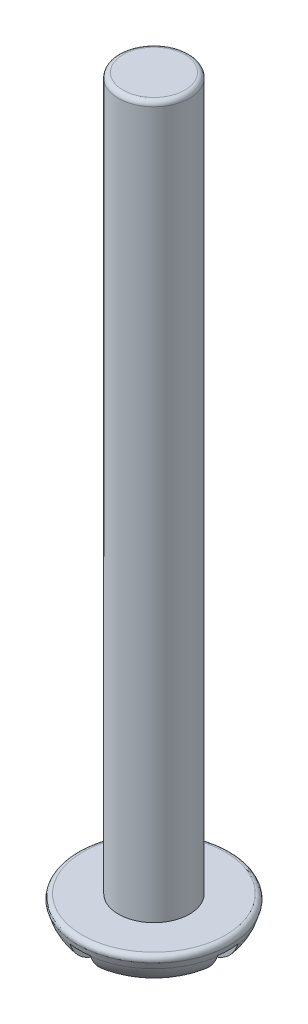
ISO-10303-21;
HEADER;
FILE_DESCRIPTION(('STEP AP214'),'2;1');
FILE_NAME('part.step','',(''),(''),'','','');
FILE_SCHEMA(('AUTOMOTIVE_DESIGN { 1 0 10303 214 1 1 1 1 }'));
ENDSEC;
DATA;
#1=APPLICATION_CONTEXT('core data for automotive mechanical design processes');
#2=APPLICATION_PROTOCOL_DEFINITION('international standard','automotive_design',2000,#1);
#3=PRODUCT_CONTEXT('',#1,'mechanical');
#4=PRODUCT('Part','Part','',(#3));
#5=PRODUCT_RELATED_PRODUCT_CATEGORY('part','',(#4));
#6=PRODUCT_DEFINITION_FORMATION('','',#4);
#7=PRODUCT_DEFINITION_CONTEXT('part definition',#1,'design');
#8=PRODUCT_DEFINITION('design','',#6,#7);
#9=PRODUCT_DEFINITION_SHAPE('','',#8);
#10=(LENGTH_UNIT() NAMED_UNIT(*) SI_UNIT(.MILLI.,.METRE.));
#11=(NAMED_UNIT(*) PLANE_ANGLE_UNIT() SI_UNIT($,.RADIAN.));
#12=(NAMED_UNIT(*) SI_UNIT($,.STERADIAN.) SOLID_ANGLE_UNIT());
#13=UNCERTAINTY_MEASURE_WITH_UNIT(LENGTH_MEASURE(1.E-05),#10,'distance_accuracy_value','');
#14=(GEOMETRIC_REPRESENTATION_CONTEXT(3) GLOBAL_UNCERTAINTY_ASSIGNED_CONTEXT((#13)) GLOBAL_UNIT_ASSIGNED_CONTEXT((#10,
#11,#12)) REPRESENTATION_CONTEXT('',''));
#15=CARTESIAN_POINT('',(0.,0.,0.));
#16=DIRECTION('',(0.,0.,1.));
#17=DIRECTION('',(1.,0.,0.));
#18=AXIS2_PLACEMENT_3D('',#15,#16,#17);
#19=CARTESIAN_POINT('',(0.,-51.2440445445355,0.));
#20=DIRECTION('',(0.,1.,0.));
#21=DIRECTION('',(0.,0.,1.));
#22=AXIS2_PLACEMENT_3D('',#19,#20,#21);
#23=PLANE('',#22);
#24=DIRECTION('',(0.,0.,1.));
#25=VECTOR('',#24,1.);
#26=CARTESIAN_POINT('',(10.4297382638731,-51.2440445445355,50.0394058023663));
#27=LINE('',#26,#25);
#28=CARTESIAN_POINT('',(10.4297382638731,-51.2440445445125,48.0079709183444));
#29=VERTEX_POINT('',#28);
#30=CARTESIAN_POINT('',(10.4297382638731,-51.2440445445355,45.3297382638731));
#31=VERTEX_POINT('',#30);
#32=EDGE_CURVE('E534',#29,#31,#27,.F.);
#33=ORIENTED_EDGE('',*,*,#32,.F.);
#34=CARTESIAN_POINT('',(10.,-51.2440445444895,44.9));
#35=DIRECTION('',(0.,1.,0.));
#36=DIRECTION('',(0.,0.,1.));
#37=AXIS2_PLACEMENT_3D('',#34,#35,#36);
#38=CIRCLE('',#37,3.13754015189303);
#39=CARTESIAN_POINT('',(9.57026173612696,-51.2440445445125,48.0079709183472));
#40=VERTEX_POINT('',#39);
#41=EDGE_CURVE('E388',#40,#29,#38,.T.);
#42=ORIENTED_EDGE('',*,*,#41,.F.);
#43=DIRECTION('',(0.,0.,1.));
#44=VECTOR('',#43,1.);
#45=CARTESIAN_POINT('',(9.57026173612696,-51.2440445445355,50.0394058023663));
#46=LINE('',#45,#44);
#47=CARTESIAN_POINT('',(9.57026173612696,-51.2440445445355,45.3297382638731));
#48=VERTEX_POINT('',#47);
#49=EDGE_CURVE('E547',#40,#48,#46,.F.);
#50=ORIENTED_EDGE('',*,*,#49,.T.);
#51=DIRECTION('',(1.,0.,0.));
#52=VECTOR('',#51,1.);
#53=CARTESIAN_POINT('',(4.46020889716683,-51.2440445445355,45.3297382638731));
#54=LINE('',#53,#52);
#55=CARTESIAN_POINT('',(6.89202908165562,-51.2440445445125,45.3297382638731));
#56=VERTEX_POINT('',#55);
#57=EDGE_CURVE('E544',#56,#48,#54,.T.);
#58=ORIENTED_EDGE('',*,*,#57,.F.);
#59=CARTESIAN_POINT('',(10.,-51.2440445444895,44.9));
#60=DIRECTION('',(0.,1.,0.));
#61=DIRECTION('',(0.,0.,1.));
#62=AXIS2_PLACEMENT_3D('',#59,#60,#61);
#63=CIRCLE('',#62,3.13754015189303);
#64=CARTESIAN_POINT('',(6.89202908165286,-51.2440445445125,44.4702617361269));
#65=VERTEX_POINT('',#64);
#66=EDGE_CURVE('E391',#65,#56,#63,.T.);
#67=ORIENTED_EDGE('',*,*,#66,.F.);
#68=DIRECTION('',(1.,0.,0.));
#69=VECTOR('',#68,1.);
#70=CARTESIAN_POINT('',(4.46020889716683,-51.2440445445355,44.4702617361269));
#71=LINE('',#70,#69);
#72=CARTESIAN_POINT('',(9.57026173612696,-51.2440445445355,44.4702617361269));
#73=VERTEX_POINT('',#72);
#74=EDGE_CURVE('E269',#65,#73,#71,.T.);
#75=ORIENTED_EDGE('',*,*,#74,.T.);
#76=DIRECTION('',(0.,0.,1.));
#77=VECTOR('',#76,1.);
#78=CARTESIAN_POINT('',(9.57026173612696,-51.2440445445355,50.0394058023663));
#79=LINE('',#78,#77);
#80=CARTESIAN_POINT('',(9.57026173612696,-51.2440445445125,41.7920290816556));
#81=VERTEX_POINT('',#80);
#82=EDGE_CURVE('E505',#73,#81,#79,.F.);
#83=ORIENTED_EDGE('',*,*,#82,.T.);
#84=CARTESIAN_POINT('',(10.,-51.2440445444895,44.9));
#85=DIRECTION('',(0.,1.,0.));
#86=DIRECTION('',(0.,0.,1.));
#87=AXIS2_PLACEMENT_3D('',#84,#85,#86);
#88=CIRCLE('',#87,3.13754015189303);
#89=CARTESIAN_POINT('',(10.4297382638731,-51.2440445445125,41.7920290816528));
#90=VERTEX_POINT('',#89);
#91=EDGE_CURVE('E155',#90,#81,#88,.T.);
#92=ORIENTED_EDGE('',*,*,#91,.F.);
#93=DIRECTION('',(0.,0.,1.));
#94=VECTOR('',#93,1.);
#95=CARTESIAN_POINT('',(10.4297382638731,-51.2440445445355,50.0394058023663));
#96=LINE('',#95,#94);
#97=CARTESIAN_POINT('',(10.4297382638731,-51.2440445445355,44.4702617361269));
#98=VERTEX_POINT('',#97);
#99=EDGE_CURVE('E162',#98,#90,#96,.F.);
#100=ORIENTED_EDGE('',*,*,#99,.F.);
#101=DIRECTION('',(1.,0.,0.));
#102=VECTOR('',#101,1.);
#103=CARTESIAN_POINT('',(4.46020889716683,-51.2440445445355,44.4702617361269));
#104=LINE('',#103,#102);
#105=CARTESIAN_POINT('',(13.1079709183444,-51.2440445445125,44.4702617361269));
#106=VERTEX_POINT('',#105);
#107=EDGE_CURVE('E158',#98,#106,#104,.T.);
#108=ORIENTED_EDGE('',*,*,#107,.T.);
#109=CARTESIAN_POINT('',(10.,-51.2440445444895,44.9));
#110=DIRECTION('',(0.,1.,0.));
#111=DIRECTION('',(0.,0.,1.));
#112=AXIS2_PLACEMENT_3D('',#109,#110,#111);
#113=CIRCLE('',#112,3.13754015189303);
#114=CARTESIAN_POINT('',(13.1079709183472,-51.2440445445125,45.3297382638731));
#115=VERTEX_POINT('',#114);
#116=EDGE_CURVE('E142',#115,#106,#113,.T.);
#117=ORIENTED_EDGE('',*,*,#116,.F.);
#118=DIRECTION('',(1.,0.,0.));
#119=VECTOR('',#118,1.);
#120=CARTESIAN_POINT('',(4.46020889716683,-51.2440445445355,45.3297382638731));
#121=LINE('',#120,#119);
#122=EDGE_CURVE('E188',#31,#115,#121,.T.);
#123=ORIENTED_EDGE('',*,*,#122,.F.);
#124=EDGE_LOOP('',(#33,#42,#50,#58,#67,#75,#83,#92,#100,#108,#117,#123));
#125=FACE_BOUND('',#124,.T.);
#126=ADVANCED_FACE('F18',(#125),#23,.F.);
#127=CARTESIAN_POINT('',(9.57026173612696,-51.2440445445355,50.0394058023663));
#128=DIRECTION('',(-1.,0.,0.));
#129=DIRECTION('',(0.,-1.,0.));
#130=AXIS2_PLACEMENT_3D('',#127,#128,#129);
#131=PLANE('',#130);
#132=DIRECTION('',(0.,0.,1.));
#133=VECTOR('',#132,1.);
#134=CARTESIAN_POINT('',(9.57026173612696,-52.2440445445355,44.9));
#135=LINE('',#134,#133);
#136=CARTESIAN_POINT('',(9.57026173612696,-52.2440445445355,45.3297382638731));
#137=VERTEX_POINT('',#136);
#138=CARTESIAN_POINT('',(9.57026173612696,-52.2440445445355,46.6432741973379));
#139=VERTEX_POINT('',#138);
#140=EDGE_CURVE('E543',#137,#139,#135,.T.);
#141=ORIENTED_EDGE('',*,*,#140,.F.);
#142=DIRECTION('',(0.,1.,0.));
#143=VECTOR('',#142,1.);
#144=CARTESIAN_POINT('',(9.57026173612696,-51.2440445445355,45.3297382638731));
#145=LINE('',#144,#143);
#146=EDGE_CURVE('E540',#48,#137,#145,.F.);
#147=ORIENTED_EDGE('',*,*,#146,.F.);
#148=ORIENTED_EDGE('',*,*,#49,.F.);
#149=DIRECTION('',(0.,0.950186561036227,0.311681727449893));
#150=VECTOR('',#149,1.);
#151=CARTESIAN_POINT('',(9.57026173612696,-51.2766683366604,47.9972696094573));
#152=LINE('',#151,#150);
#153=CARTESIAN_POINT('',(9.57026173612696,-51.2766683366506,47.9972696094605));
#154=VERTEX_POINT('',#153);
#155=EDGE_CURVE('E390',#154,#40,#152,.T.);
#156=ORIENTED_EDGE('',*,*,#155,.F.);
#157=CARTESIAN_POINT('',(9.57026173612696,-52.2440445445355,46.6432741973379));
#158=CARTESIAN_POINT('',(9.57026173612696,-52.2440517508388,46.6881301465086));
#159=CARTESIAN_POINT('',(9.57026173612696,-52.242012211474,46.7329882302311));
#160=CARTESIAN_POINT('',(9.57026173612696,-52.2338386033224,46.8223397292442));
#161=CARTESIAN_POINT('',(9.57026173612696,-52.2277035882181,46.8668330578472));
#162=CARTESIAN_POINT('',(9.57026173612696,-52.2113435508746,46.9550350246917));
#163=CARTESIAN_POINT('',(9.57026173612696,-52.2011213125293,46.9987441759228));
#164=CARTESIAN_POINT('',(9.57026173612696,-52.1766544744115,47.0850007763118));
#165=CARTESIAN_POINT('',(9.57026173612696,-52.1624106079993,47.1275484357224));
#166=CARTESIAN_POINT('',(9.57026173612696,-52.116579759776,47.2456445128962));
#167=CARTESIAN_POINT('',(9.57026173612696,-52.080378767751,47.3194636126151));
#168=CARTESIAN_POINT('',(9.57026173612696,-51.9958084458344,47.459666913603));
#169=CARTESIAN_POINT('',(9.57026173612696,-51.9474469285752,47.5260558490211));
#170=CARTESIAN_POINT('',(9.57026173612696,-51.8413198326966,47.6478278381575));
#171=CARTESIAN_POINT('',(9.57026173612696,-51.783829643513,47.7034510174651));
#172=CARTESIAN_POINT('',(9.57026173612696,-51.660217490618,47.8040866049667));
#173=CARTESIAN_POINT('',(9.57026173612698,-51.5941003742937,47.8491049323687));
#174=CARTESIAN_POINT('',(9.57026173612695,-51.4852083664642,47.9103176350552));
#175=CARTESIAN_POINT('',(9.57026173612693,-51.4446618838942,47.9305704285893));
#176=CARTESIAN_POINT('',(9.57026173612699,-51.3618677526718,47.9669984341043));
#177=CARTESIAN_POINT('',(9.57026173612707,-51.3196234370506,47.9831812220735));
#178=CARTESIAN_POINT('',(9.57026173612727,-51.2766683366561,47.9972696094587));
#179=B_SPLINE_CURVE_WITH_KNOTS('',3,(#157,#158,#159,#160,#161,#162,#163,#164,#165,#166,#167,
#168,#169,#170,#171,#172,#173,#174,#175,#176,#177,#178),.UNSPECIFIED.,.F.,.F.,(4,2,2,2,2,2,2,2,
2,2,4),(0.,0.134523842047519,0.269078778491122,0.403542222429795,0.537981162231517,
0.783317564876037,1.02849674999737,1.26733850226078,1.5060466249651,1.64182243435796,
1.77734360560221),.UNSPECIFIED.);
#180=EDGE_CURVE('E262',#139,#154,#179,.T.);
#181=ORIENTED_EDGE('',*,*,#180,.F.);
#182=EDGE_LOOP('',(#141,#147,#148,#156,#181));
#183=FACE_BOUND('',#182,.T.);
#184=ADVANCED_FACE('F377',(#183),#131,.F.);
#185=CARTESIAN_POINT('',(4.46020889716683,-51.2440445445355,45.3297382638731));
#186=DIRECTION('',(0.,0.,-1.));
#187=DIRECTION('',(0.,1.,0.));
#188=AXIS2_PLACEMENT_3D('',#185,#186,#187);
#189=PLANE('',#188);
#190=DIRECTION('',(1.,0.,0.));
#191=VECTOR('',#190,1.);
#192=CARTESIAN_POINT('',(10.,-52.2440445445355,45.3297382638731));
#193=LINE('',#192,#191);
#194=CARTESIAN_POINT('',(8.25672580266215,-52.2440445445355,45.3297382638731));
#195=VERTEX_POINT('',#194);
#196=EDGE_CURVE('E565',#195,#137,#193,.T.);
#197=ORIENTED_EDGE('',*,*,#196,.F.);
#198=CARTESIAN_POINT('',(6.90273039054124,-51.276668336656,45.3297382638731));
#199=CARTESIAN_POINT('',(6.91497019050474,-51.3139806844597,45.3297382638731));
#200=CARTESIAN_POINT('',(6.92878654769642,-51.3507557521779,45.3297382638731));
#201=CARTESIAN_POINT('',(6.95947563099631,-51.4230043509714,45.3297382638731));
#202=CARTESIAN_POINT('',(6.97634812160456,-51.4584779820798,45.3297382638731));
#203=CARTESIAN_POINT('',(7.03134429321369,-51.5624945272515,45.3297382638731));
#204=CARTESIAN_POINT('',(7.07388977168227,-51.6287639426499,45.3297382638731));
#205=CARTESIAN_POINT('',(7.16947807480539,-51.7532117619153,45.3297382638731));
#206=CARTESIAN_POINT('',(7.22252373513465,-51.8113879728923,45.3297382638731));
#207=CARTESIAN_POINT('',(7.33757042584209,-51.9180667957562,45.3297382638731));
#208=CARTESIAN_POINT('',(7.3995694651401,-51.9665715527166,45.3297382638731));
#209=CARTESIAN_POINT('',(7.53113763895904,-52.0528868607374,45.3297382638731));
#210=CARTESIAN_POINT('',(7.60075026441981,-52.0906310006598,45.3297382638731));
#211=CARTESIAN_POINT('',(7.74527984697558,-52.1541000828859,45.3297382638731));
#212=CARTESIAN_POINT('',(7.8201977126339,-52.1798229606953,45.3297382638731));
#213=CARTESIAN_POINT('',(7.95550179678722,-52.2141903018016,45.3297382638731));
#214=CARTESIAN_POINT('',(8.01525126070812,-52.2254062108367,45.3297382638731));
#215=CARTESIAN_POINT('',(8.13557393478325,-52.2403368668091,45.3297382638731));
#216=CARTESIAN_POINT('',(8.19614549408786,-52.2440648962271,45.3297382638731));
#217=CARTESIAN_POINT('',(8.25672580266215,-52.2440445445355,45.3297382638731));
#218=B_SPLINE_CURVE_WITH_KNOTS('',3,(#198,#199,#200,#201,#202,#203,#204,#205,#206,#207,#208,
#209,#210,#211,#212,#213,#214,#215,#216,#217),.UNSPECIFIED.,.F.,.F.,(4,2,2,2,2,2,2,2,2,4),(0.,
0.117732729425165,0.235456390442122,0.470495711789333,0.70559859456991,0.940649274725501,
1.17712067374326,1.41363266871307,1.59555904089511,1.77716241440037),.UNSPECIFIED.);
#219=CARTESIAN_POINT('',(6.90273039053949,-51.2766683366506,45.3297382638731));
#220=VERTEX_POINT('',#219);
#221=EDGE_CURVE('E351',#220,#195,#218,.T.);
#222=ORIENTED_EDGE('',*,*,#221,.F.);
#223=DIRECTION('',(-0.31168172744987,0.950186561036234,0.));
#224=VECTOR('',#223,1.);
#225=CARTESIAN_POINT('',(6.90273039054271,-51.2766683366604,45.3297382638731));
#226=LINE('',#225,#224);
#227=EDGE_CURVE('E549',#220,#56,#226,.T.);
#228=ORIENTED_EDGE('',*,*,#227,.T.);
#229=ORIENTED_EDGE('',*,*,#57,.T.);
#230=ORIENTED_EDGE('',*,*,#146,.T.);
#231=EDGE_LOOP('',(#197,#222,#228,#229,#230));
#232=FACE_BOUND('',#231,.T.);
#233=ADVANCED_FACE('F372',(#232),#189,.T.);
#234=CARTESIAN_POINT('',(10.,-52.2440445445355,44.9));
#235=DIRECTION('',(0.,-1.,0.));
#236=DIRECTION('',(1.,0.,0.));
#237=AXIS2_PLACEMENT_3D('',#234,#235,#236);
#238=PLANE('',#237);
#239=CARTESIAN_POINT('',(10.,-52.2440445445355,44.9));
#240=DIRECTION('',(0.,1.,0.));
#241=DIRECTION('',(-0.970934082360066,0.,0.239347044501527));
#242=AXIS2_PLACEMENT_3D('',#239,#240,#241);
#243=CIRCLE('',#242,1.79546091646146);
#244=EDGE_CURVE('E348',#195,#139,#243,.T.);
#245=ORIENTED_EDGE('',*,*,#244,.F.);
#246=ORIENTED_EDGE('',*,*,#196,.T.);
#247=ORIENTED_EDGE('',*,*,#140,.T.);
#248=EDGE_LOOP('',(#245,#246,#247));
#249=FACE_BOUND('',#248,.T.);
#250=ADVANCED_FACE('F376',(#249),#238,.T.);
#251=CARTESIAN_POINT('',(10.4297382638731,-51.2440445445355,50.0394058023663));
#252=DIRECTION('',(-1.,0.,0.));
#253=DIRECTION('',(0.,-1.,0.));
#254=AXIS2_PLACEMENT_3D('',#251,#252,#253);
#255=PLANE('',#254);
#256=DIRECTION('',(0.,0.,1.));
#257=VECTOR('',#256,1.);
#258=CARTESIAN_POINT('',(10.4297382638731,-52.2440445445355,44.9));
#259=LINE('',#258,#257);
#260=CARTESIAN_POINT('',(10.4297382638731,-52.2440445445355,46.6432741973379));
#261=VERTEX_POINT('',#260);
#262=CARTESIAN_POINT('',(10.4297382638731,-52.2440445445355,45.3297382638731));
#263=VERTEX_POINT('',#262);
#264=EDGE_CURVE('E536',#261,#263,#259,.F.);
#265=ORIENTED_EDGE('',*,*,#264,.F.);
#266=CARTESIAN_POINT('',(10.4297382638731,-51.276668336656,47.9972696094588));
#267=CARTESIAN_POINT('',(10.4297382638731,-51.3139806844597,47.9850298094953));
#268=CARTESIAN_POINT('',(10.4297382638731,-51.3507557521779,47.9712134523036));
#269=CARTESIAN_POINT('',(10.4297382638731,-51.4230043509714,47.9405243690037));
#270=CARTESIAN_POINT('',(10.4297382638731,-51.4584779820798,47.9236518783955));
#271=CARTESIAN_POINT('',(10.4297382638731,-51.5624945272515,47.8686557067863));
#272=CARTESIAN_POINT('',(10.4297382638731,-51.6287639426499,47.8261102283178));
#273=CARTESIAN_POINT('',(10.4297382638731,-51.7532117619153,47.7305219251946));
#274=CARTESIAN_POINT('',(10.4297382638731,-51.8113879728923,47.6774762648654));
#275=CARTESIAN_POINT('',(10.4297382638731,-51.9180667957562,47.5624295741579));
#276=CARTESIAN_POINT('',(10.4297382638731,-51.9665715527166,47.5004305348599));
#277=CARTESIAN_POINT('',(10.4297382638731,-52.0528868607374,47.368862361041));
#278=CARTESIAN_POINT('',(10.4297382638731,-52.0906310006598,47.2992497355802));
#279=CARTESIAN_POINT('',(10.4297382638731,-52.1541000828859,47.1547201530244));
#280=CARTESIAN_POINT('',(10.4297382638731,-52.1798229606953,47.0798022873661));
#281=CARTESIAN_POINT('',(10.4297382638731,-52.2141903018016,46.9444982032128));
#282=CARTESIAN_POINT('',(10.4297382638731,-52.2254062108367,46.8847487392919));
#283=CARTESIAN_POINT('',(10.4297382638731,-52.2403368668091,46.7644260652168));
#284=CARTESIAN_POINT('',(10.4297382638731,-52.2440648962271,46.7038545059122));
#285=CARTESIAN_POINT('',(10.4297382638731,-52.2440445445355,46.6432741973379));
#286=B_SPLINE_CURVE_WITH_KNOTS('',3,(#266,#267,#268,#269,#270,#271,#272,#273,#274,#275,#276,
#277,#278,#279,#280,#281,#282,#283,#284,#285),.UNSPECIFIED.,.F.,.F.,(4,2,2,2,2,2,2,2,2,4),(0.,
0.117732729425164,0.23545639044212,0.470495711789333,0.705598594569909,0.940649274725502,
1.17712067374326,1.41363266871308,1.59555904089511,1.77716241440038),.UNSPECIFIED.);
#287=CARTESIAN_POINT('',(10.4297382638731,-51.2766683366506,47.9972696094605));
#288=VERTEX_POINT('',#287);
#289=EDGE_CURVE('E229',#288,#261,#286,.T.);
#290=ORIENTED_EDGE('',*,*,#289,.F.);
#291=DIRECTION('',(0.,0.950186561036227,0.311681727449893));
#292=VECTOR('',#291,1.);
#293=CARTESIAN_POINT('',(10.4297382638731,-51.2766683366604,47.9972696094573));
#294=LINE('',#293,#292);
#295=EDGE_CURVE('E537',#288,#29,#294,.T.);
#296=ORIENTED_EDGE('',*,*,#295,.T.);
#297=ORIENTED_EDGE('',*,*,#32,.T.);
#298=DIRECTION('',(0.,1.,0.));
#299=VECTOR('',#298,1.);
#300=CARTESIAN_POINT('',(10.4297382638731,-51.2440445445355,45.3297382638731));
#301=LINE('',#300,#299);
#302=EDGE_CURVE('E526',#263,#31,#301,.T.);
#303=ORIENTED_EDGE('',*,*,#302,.F.);
#304=EDGE_LOOP('',(#265,#290,#296,#297,#303));
#305=FACE_BOUND('',#304,.T.);
#306=ADVANCED_FACE('F617',(#305),#255,.T.);
#307=CARTESIAN_POINT('',(10.,-52.2440445445355,44.9));
#308=DIRECTION('',(0.,-1.,0.));
#309=DIRECTION('',(1.,0.,0.));
#310=AXIS2_PLACEMENT_3D('',#307,#308,#309);
#311=PLANE('',#310);
#312=ORIENTED_EDGE('',*,*,#264,.T.);
#313=DIRECTION('',(1.,0.,0.));
#314=VECTOR('',#313,1.);
#315=CARTESIAN_POINT('',(4.46020889716683,-52.2440445445355,45.3297382638731));
#316=LINE('',#315,#314);
#317=CARTESIAN_POINT('',(11.7432741973325,-52.2440445445355,45.3297382638734));
#318=VERTEX_POINT('',#317);
#319=EDGE_CURVE('E531',#318,#263,#316,.F.);
#320=ORIENTED_EDGE('',*,*,#319,.F.);
#321=CARTESIAN_POINT('',(10.,-52.2440445445355,44.9));
#322=DIRECTION('',(0.,1.,0.));
#323=DIRECTION('',(0.239347044501533,0.,0.970934082360065));
#324=AXIS2_PLACEMENT_3D('',#321,#322,#323);
#325=CIRCLE('',#324,1.79546091646145);
#326=EDGE_CURVE('E341',#261,#318,#325,.T.);
#327=ORIENTED_EDGE('',*,*,#326,.F.);
#328=EDGE_LOOP('',(#312,#320,#327));
#329=FACE_BOUND('',#328,.T.);
#330=ADVANCED_FACE('F215',(#329),#311,.T.);
#331=CARTESIAN_POINT('',(4.46020889716683,-51.2440445445355,45.3297382638731));
#332=DIRECTION('',(0.,0.,-1.));
#333=DIRECTION('',(0.,1.,0.));
#334=AXIS2_PLACEMENT_3D('',#331,#332,#333);
#335=PLANE('',#334);
#336=ORIENTED_EDGE('',*,*,#302,.T.);
#337=ORIENTED_EDGE('',*,*,#122,.T.);
#338=DIRECTION('',(-0.311681727449801,-0.950186561036256,0.));
#339=VECTOR('',#338,1.);
#340=CARTESIAN_POINT('',(13.1079709183396,-51.2440445445355,45.3297382638731));
#341=LINE('',#340,#339);
#342=CARTESIAN_POINT('',(13.0972696094606,-51.2766683366506,45.3297382638731));
#343=VERTEX_POINT('',#342);
#344=EDGE_CURVE('E151',#115,#343,#341,.T.);
#345=ORIENTED_EDGE('',*,*,#344,.T.);
#346=CARTESIAN_POINT('',(11.7432741973325,-52.2440445445355,45.3297382638731));
#347=CARTESIAN_POINT('',(11.7881301465031,-52.244051750839,45.3297382638731));
#348=CARTESIAN_POINT('',(11.8329882302255,-52.2420122114744,45.3297382638731));
#349=CARTESIAN_POINT('',(11.9223397292383,-52.2338386033231,45.3297382638731));
#350=CARTESIAN_POINT('',(11.9668330578411,-52.2277035882191,45.3297382638731));
#351=CARTESIAN_POINT('',(12.0550350246854,-52.211343550876,45.3297382638731));
#352=CARTESIAN_POINT('',(12.0987441759165,-52.2011213125308,45.3297382638731));
#353=CARTESIAN_POINT('',(12.1850007763053,-52.1766544744135,45.3297382638731));
#354=CARTESIAN_POINT('',(12.2275484357159,-52.1624106080016,45.3297382638731));
#355=CARTESIAN_POINT('',(12.3456445128898,-52.1165797597789,45.3297382638731));
#356=CARTESIAN_POINT('',(12.419463612609,-52.0803787677543,45.3297382638731));
#357=CARTESIAN_POINT('',(12.5596669135973,-51.9958084458383,45.3297382638731));
#358=CARTESIAN_POINT('',(12.6260558490156,-51.9474469285794,45.3297382638731));
#359=CARTESIAN_POINT('',(12.7478278381526,-51.8413198327014,45.3297382638731));
#360=CARTESIAN_POINT('',(12.8034510174605,-51.7838296435181,45.3297382638731));
#361=CARTESIAN_POINT('',(12.9040866049627,-51.6602174906235,45.3297382638731));
#362=CARTESIAN_POINT('',(12.949104932365,-51.5941003742994,45.3297382638731));
#363=CARTESIAN_POINT('',(13.0103176350526,-51.4852083664692,45.3297382638731));
#364=CARTESIAN_POINT('',(13.0305704285874,-51.4446618838983,45.3297382638731));
#365=CARTESIAN_POINT('',(13.0669984341035,-51.3618677526739,45.329738263873));
#366=CARTESIAN_POINT('',(13.0831812220732,-51.3196234370517,45.329738263873));
#367=CARTESIAN_POINT('',(13.0972696094588,-51.2766683366561,45.3297382638729));
#368=B_SPLINE_CURVE_WITH_KNOTS('',3,(#346,#347,#348,#349,#350,#351,#352,#353,#354,#355,#356,
#357,#358,#359,#360,#361,#362,#363,#364,#365,#366,#367),.UNSPECIFIED.,.F.,.F.,(4,2,2,2,2,2,2,2,
2,2,4),(0.,0.134523842047084,0.269078778490259,0.403542222428506,0.537981162229803,
0.783317564874445,1.02849674999588,1.26733850225934,1.50604662496373,1.64182243435996,
1.77734360560757),.UNSPECIFIED.);
#369=EDGE_CURVE('E227',#318,#343,#368,.T.);
#370=ORIENTED_EDGE('',*,*,#369,.F.);
#371=ORIENTED_EDGE('',*,*,#319,.T.);
#372=EDGE_LOOP('',(#336,#337,#345,#370,#371));
#373=FACE_BOUND('',#372,.T.);
#374=ADVANCED_FACE('F209',(#373),#335,.T.);
#375=CARTESIAN_POINT('',(10.,-52.2440445445355,44.9));
#376=DIRECTION('',(0.,-1.,0.));
#377=DIRECTION('',(1.,0.,0.));
#378=AXIS2_PLACEMENT_3D('',#375,#376,#377);
#379=PLANE('',#378);
#380=DIRECTION('',(0.,0.,1.));
#381=VECTOR('',#380,1.);
#382=CARTESIAN_POINT('',(10.4297382638731,-52.2440445445355,50.0394058023663));
#383=LINE('',#382,#381);
#384=CARTESIAN_POINT('',(10.4297382638731,-52.2440445445355,43.156725802681));
#385=VERTEX_POINT('',#384);
#386=CARTESIAN_POINT('',(10.4297382638731,-52.2440445445355,44.4702617361269));
#387=VERTEX_POINT('',#386);
#388=EDGE_CURVE('E177',#385,#387,#383,.T.);
#389=ORIENTED_EDGE('',*,*,#388,.F.);
#390=CARTESIAN_POINT('',(10.,-52.2440445445355,44.9));
#391=DIRECTION('',(0.,1.,0.));
#392=DIRECTION('',(0.970934082359462,0.,-0.239347044503978));
#393=AXIS2_PLACEMENT_3D('',#390,#391,#392);
#394=CIRCLE('',#393,1.79546091644314);
#395=CARTESIAN_POINT('',(11.743274197319,-52.2440445445355,44.4702617361269));
#396=VERTEX_POINT('',#395);
#397=EDGE_CURVE('E192',#396,#385,#394,.T.);
#398=ORIENTED_EDGE('',*,*,#397,.F.);
#399=DIRECTION('',(1.,0.,0.));
#400=VECTOR('',#399,1.);
#401=CARTESIAN_POINT('',(4.46020889716683,-52.2440445445355,44.4702617361269));
#402=LINE('',#401,#400);
#403=EDGE_CURVE('E174',#396,#387,#402,.F.);
#404=ORIENTED_EDGE('',*,*,#403,.T.);
#405=EDGE_LOOP('',(#389,#398,#404));
#406=FACE_BOUND('',#405,.T.);
#407=ADVANCED_FACE('F198',(#406),#379,.T.);
#408=CARTESIAN_POINT('',(10.4297382638731,-51.2440445445355,50.0394058023663));
#409=DIRECTION('',(-1.,0.,0.));
#410=DIRECTION('',(0.,-1.,0.));
#411=AXIS2_PLACEMENT_3D('',#408,#409,#410);
#412=PLANE('',#411);
#413=DIRECTION('',(0.,1.,0.));
#414=VECTOR('',#413,1.);
#415=CARTESIAN_POINT('',(10.4297382638731,-51.2440445445355,44.4702617361269));
#416=LINE('',#415,#414);
#417=EDGE_CURVE('E167',#387,#98,#416,.T.);
#418=ORIENTED_EDGE('',*,*,#417,.T.);
#419=ORIENTED_EDGE('',*,*,#99,.T.);
#420=DIRECTION('',(0.,-0.950186561036227,0.311681727449893));
#421=VECTOR('',#420,1.);
#422=CARTESIAN_POINT('',(10.4297382638731,-51.2440445445355,41.7920290816604));
#423=LINE('',#422,#421);
#424=CARTESIAN_POINT('',(10.4297382638731,-51.2766683366506,41.8027303905395));
#425=VERTEX_POINT('',#424);
#426=EDGE_CURVE('E184',#90,#425,#423,.T.);
#427=ORIENTED_EDGE('',*,*,#426,.T.);
#428=CARTESIAN_POINT('',(10.4297382638731,-52.2440445445355,43.156725802681));
#429=CARTESIAN_POINT('',(10.4297382638731,-52.2440517508394,43.1118698535108));
#430=CARTESIAN_POINT('',(10.4297382638731,-52.2420122114752,43.0670117697887));
#431=CARTESIAN_POINT('',(10.4297382638731,-52.2338386033249,42.9776602707765));
#432=CARTESIAN_POINT('',(10.4297382638731,-52.2277035882214,42.933166942174));
#433=CARTESIAN_POINT('',(10.4297382638731,-52.2113435508794,42.8449649753302));
#434=CARTESIAN_POINT('',(10.4297382638731,-52.2011213125348,42.8012558240994));
#435=CARTESIAN_POINT('',(10.4297382638731,-52.1766544744187,42.714999223711));
#436=CARTESIAN_POINT('',(10.4297382638731,-52.1624106080074,42.6724515643006));
#437=CARTESIAN_POINT('',(10.4297382638731,-52.1165797597862,42.5543554871263));
#438=CARTESIAN_POINT('',(10.4297382638731,-52.0803787677625,42.4805363874067));
#439=CARTESIAN_POINT('',(10.4297382638731,-51.9958084458481,42.3403330864172));
#440=CARTESIAN_POINT('',(10.4297382638731,-51.9474469285901,42.2739441509981));
#441=CARTESIAN_POINT('',(10.4297382638731,-51.8413198327134,42.1521721618598));
#442=CARTESIAN_POINT('',(10.4297382638731,-51.7838296435307,42.0965489825511));
#443=CARTESIAN_POINT('',(10.4297382638731,-51.6602174906373,41.9959133950473));
#444=CARTESIAN_POINT('',(10.4297382638731,-51.5941003743137,41.9508950676442));
#445=CARTESIAN_POINT('',(10.4297382638731,-51.4852083664817,41.8896823649539));
#446=CARTESIAN_POINT('',(10.4297382638731,-51.4446618839085,41.8694295714174));
#447=CARTESIAN_POINT('',(10.4297382638731,-51.3618677526792,41.8330015658986));
#448=CARTESIAN_POINT('',(10.429738263873,-51.3196234370544,41.8168187779277));
#449=CARTESIAN_POINT('',(10.4297382638729,-51.2766683366561,41.8027303905413));
#450=B_SPLINE_CURVE_WITH_KNOTS('',3,(#428,#429,#430,#431,#432,#433,#434,#435,#436,#437,#438,
#439,#440,#441,#442,#443,#444,#445,#446,#447,#448,#449),.UNSPECIFIED.,.F.,.F.,(4,2,2,2,2,2,2,2,
2,2,4),(0.,0.134523842046007,0.269078778488094,0.403542222425284,0.537981162225511,
0.783317564870431,1.02849674999213,1.26733850225573,1.50604662496028,1.64182243436497,
1.77734360562104),.UNSPECIFIED.);
#451=EDGE_CURVE('E329',#385,#425,#450,.T.);
#452=ORIENTED_EDGE('',*,*,#451,.F.);
#453=ORIENTED_EDGE('',*,*,#388,.T.);
#454=EDGE_LOOP('',(#418,#419,#427,#452,#453));
#455=FACE_BOUND('',#454,.T.);
#456=ADVANCED_FACE('F208',(#455),#412,.T.);
#457=CARTESIAN_POINT('',(4.46020889716683,-51.2440445445355,44.4702617361269));
#458=DIRECTION('',(0.,0.,-1.));
#459=DIRECTION('',(0.,1.,0.));
#460=AXIS2_PLACEMENT_3D('',#457,#458,#459);
#461=PLANE('',#460);
#462=ORIENTED_EDGE('',*,*,#417,.F.);
#463=ORIENTED_EDGE('',*,*,#403,.F.);
#464=CARTESIAN_POINT('',(13.0972696094588,-51.276668336656,44.4702617361269));
#465=CARTESIAN_POINT('',(13.0850298094953,-51.3139806844597,44.4702617361269));
#466=CARTESIAN_POINT('',(13.0712134523036,-51.3507557521779,44.4702617361269));
#467=CARTESIAN_POINT('',(13.0405243690037,-51.4230043509714,44.4702617361269));
#468=CARTESIAN_POINT('',(13.0236518783955,-51.4584779820798,44.4702617361269));
#469=CARTESIAN_POINT('',(12.9686557067864,-51.5624945272515,44.4702617361269));
#470=CARTESIAN_POINT('',(12.9261102283178,-51.6287639426499,44.470261736127));
#471=CARTESIAN_POINT('',(12.8305219251946,-51.7532117619153,44.470261736127));
#472=CARTESIAN_POINT('',(12.7774762648654,-51.8113879728923,44.470261736127));
#473=CARTESIAN_POINT('',(12.662429574158,-51.9180667957562,44.4702617361269));
#474=CARTESIAN_POINT('',(12.6004305348599,-51.9665715527166,44.4702617361269));
#475=CARTESIAN_POINT('',(12.468862361041,-52.0528868607374,44.4702617361269));
#476=CARTESIAN_POINT('',(12.3992497355802,-52.0906310006598,44.4702617361269));
#477=CARTESIAN_POINT('',(12.2547201530245,-52.1541000828858,44.4702617361269));
#478=CARTESIAN_POINT('',(12.1798022873661,-52.1798229606953,44.4702617361269));
#479=CARTESIAN_POINT('',(12.0444982032098,-52.2141903018024,44.4702617361269));
#480=CARTESIAN_POINT('',(11.9847487392857,-52.2254062108379,44.4702617361269));
#481=CARTESIAN_POINT('',(11.8644260652043,-52.2403368668103,44.4702617361269));
#482=CARTESIAN_POINT('',(11.8038545058965,-52.2440648962279,44.4702617361269));
#483=CARTESIAN_POINT('',(11.743274197319,-52.2440445445355,44.4702617361269));
#484=B_SPLINE_CURVE_WITH_KNOTS('',3,(#464,#465,#466,#467,#468,#469,#470,#471,#472,#473,#474,
#475,#476,#477,#478,#479,#480,#481,#482,#483),.UNSPECIFIED.,.F.,.F.,(4,2,2,2,2,2,2,2,2,4),(0.,
0.117732729425164,0.235456390442114,0.470495711789333,0.705598594569912,0.940649274725502,
1.17712067374324,1.41363266871308,1.59555904090453,1.77716241441921),.UNSPECIFIED.);
#485=CARTESIAN_POINT('',(13.0972696094606,-51.2766683366506,44.4702617361269));
#486=VERTEX_POINT('',#485);
#487=EDGE_CURVE('E172',#486,#396,#484,.T.);
#488=ORIENTED_EDGE('',*,*,#487,.F.);
#489=DIRECTION('',(-0.311681727449801,-0.950186561036256,0.));
#490=VECTOR('',#489,1.);
#491=CARTESIAN_POINT('',(13.1079709183396,-51.2440445445355,44.4702617361269));
#492=LINE('',#491,#490);
#493=EDGE_CURVE('E148',#106,#486,#492,.T.);
#494=ORIENTED_EDGE('',*,*,#493,.F.);
#495=ORIENTED_EDGE('',*,*,#107,.F.);
#496=EDGE_LOOP('',(#462,#463,#488,#494,#495));
#497=FACE_BOUND('',#496,.T.);
#498=ADVANCED_FACE('F169',(#497),#461,.F.);
#499=CARTESIAN_POINT('',(9.57026173612696,-51.2440445445355,50.0394058023663));
#500=DIRECTION('',(-1.,0.,0.));
#501=DIRECTION('',(0.,-1.,0.));
#502=AXIS2_PLACEMENT_3D('',#499,#500,#501);
#503=PLANE('',#502);
#504=DIRECTION('',(0.,1.,0.));
#505=VECTOR('',#504,1.);
#506=CARTESIAN_POINT('',(9.57026173612696,-51.2440445445355,44.4702617361269));
#507=LINE('',#506,#505);
#508=CARTESIAN_POINT('',(9.57026173612696,-52.2440445445355,44.4702617361269));
#509=VERTEX_POINT('',#508);
#510=EDGE_CURVE('E263',#73,#509,#507,.F.);
#511=ORIENTED_EDGE('',*,*,#510,.T.);
#512=DIRECTION('',(0.,0.,1.));
#513=VECTOR('',#512,1.);
#514=CARTESIAN_POINT('',(9.57026173612696,-52.2440445445355,44.9));
#515=LINE('',#514,#513);
#516=CARTESIAN_POINT('',(9.57026173612696,-52.2440445445355,43.156725802681));
#517=VERTEX_POINT('',#516);
#518=EDGE_CURVE('E270',#517,#509,#515,.T.);
#519=ORIENTED_EDGE('',*,*,#518,.F.);
#520=CARTESIAN_POINT('',(9.57026173612696,-51.276668336656,41.8027303905412));
#521=CARTESIAN_POINT('',(9.57026173612696,-51.3139806844597,41.8149701905047));
#522=CARTESIAN_POINT('',(9.57026173612696,-51.3507557521779,41.8287865476964));
#523=CARTESIAN_POINT('',(9.57026173612696,-51.4230043509714,41.8594756309963));
#524=CARTESIAN_POINT('',(9.57026173612696,-51.4584779820798,41.8763481216045));
#525=CARTESIAN_POINT('',(9.57026173612696,-51.5624945272515,41.9313442932137));
#526=CARTESIAN_POINT('',(9.57026173612696,-51.6287639426499,41.9738897716823));
#527=CARTESIAN_POINT('',(9.57026173612696,-51.7532117619153,42.0694780748054));
#528=CARTESIAN_POINT('',(9.57026173612696,-51.8113879728923,42.1225237351346));
#529=CARTESIAN_POINT('',(9.57026173612696,-51.9180667957563,42.2375704258421));
#530=CARTESIAN_POINT('',(9.57026173612696,-51.9665715527166,42.2995694651401));
#531=CARTESIAN_POINT('',(9.57026173612696,-52.0528868607374,42.431137638959));
#532=CARTESIAN_POINT('',(9.57026173612696,-52.0906310006598,42.5007502644198));
#533=CARTESIAN_POINT('',(9.57026173612696,-52.1541000828858,42.6452798469756));
#534=CARTESIAN_POINT('',(9.57026173612696,-52.1798229606953,42.7201977126339));
#535=CARTESIAN_POINT('',(9.57026173612696,-52.2141903018024,42.8555017967903));
#536=CARTESIAN_POINT('',(9.57026173612696,-52.2254062108379,42.9152512607143));
#537=CARTESIAN_POINT('',(9.57026173612696,-52.2403368668103,43.0355739347958));
#538=CARTESIAN_POINT('',(9.57026173612696,-52.2440648962279,43.0961454941036));
#539=CARTESIAN_POINT('',(9.57026173612696,-52.2440445445355,43.156725802681));
#540=B_SPLINE_CURVE_WITH_KNOTS('',3,(#520,#521,#522,#523,#524,#525,#526,#527,#528,#529,#530,
#531,#532,#533,#534,#535,#536,#537,#538,#539),.UNSPECIFIED.,.F.,.F.,(4,2,2,2,2,2,2,2,2,4),(0.,
0.117732729425164,0.23545639044212,0.470495711789333,0.705598594569923,0.940649274725507,
1.17712067374324,1.41363266871307,1.59555904090451,1.77716241441919),.UNSPECIFIED.);
#541=CARTESIAN_POINT('',(9.57026173612696,-51.2766683366506,41.8027303905395));
#542=VERTEX_POINT('',#541);
#543=EDGE_CURVE('E306',#542,#517,#540,.T.);
#544=ORIENTED_EDGE('',*,*,#543,.F.);
#545=DIRECTION('',(0.,-0.950186561036227,0.311681727449893));
#546=VECTOR('',#545,1.);
#547=CARTESIAN_POINT('',(9.57026173612696,-51.2440445445355,41.7920290816604));
#548=LINE('',#547,#546);
#549=EDGE_CURVE('E166',#81,#542,#548,.T.);
#550=ORIENTED_EDGE('',*,*,#549,.F.);
#551=ORIENTED_EDGE('',*,*,#82,.F.);
#552=EDGE_LOOP('',(#511,#519,#544,#550,#551));
#553=FACE_BOUND('',#552,.T.);
#554=ADVANCED_FACE('F293',(#553),#503,.F.);
#555=CARTESIAN_POINT('',(10.,-52.2440445445355,44.9));
#556=DIRECTION('',(0.,-1.,0.));
#557=DIRECTION('',(1.,0.,0.));
#558=AXIS2_PLACEMENT_3D('',#555,#556,#557);
#559=PLANE('',#558);
#560=DIRECTION('',(1.,0.,0.));
#561=VECTOR('',#560,1.);
#562=CARTESIAN_POINT('',(4.46020889716683,-52.2440445445355,44.4702617361269));
#563=LINE('',#562,#561);
#564=CARTESIAN_POINT('',(8.25672580266571,-52.2440445445355,44.4702617361278));
#565=VERTEX_POINT('',#564);
#566=EDGE_CURVE('E260',#509,#565,#563,.F.);
#567=ORIENTED_EDGE('',*,*,#566,.T.);
#568=CARTESIAN_POINT('',(10.,-52.2440445445355,44.9));
#569=DIRECTION('',(0.,1.,0.));
#570=DIRECTION('',(-0.239347044503974,0.,-0.970934082359463));
#571=AXIS2_PLACEMENT_3D('',#568,#569,#570);
#572=CIRCLE('',#571,1.79546091644314);
#573=EDGE_CURVE('E276',#517,#565,#572,.T.);
#574=ORIENTED_EDGE('',*,*,#573,.F.);
#575=ORIENTED_EDGE('',*,*,#518,.T.);
#576=EDGE_LOOP('',(#567,#574,#575));
#577=FACE_BOUND('',#576,.T.);
#578=ADVANCED_FACE('F283',(#577),#559,.T.);
#579=CARTESIAN_POINT('',(4.46020889716683,-51.2440445445355,44.4702617361269));
#580=DIRECTION('',(0.,0.,-1.));
#581=DIRECTION('',(0.,1.,0.));
#582=AXIS2_PLACEMENT_3D('',#579,#580,#581);
#583=PLANE('',#582);
#584=ORIENTED_EDGE('',*,*,#566,.F.);
#585=ORIENTED_EDGE('',*,*,#510,.F.);
#586=ORIENTED_EDGE('',*,*,#74,.F.);
#587=DIRECTION('',(-0.31168172744987,0.950186561036234,0.));
#588=VECTOR('',#587,1.);
#589=CARTESIAN_POINT('',(6.90273039054271,-51.2766683366604,44.4702617361269));
#590=LINE('',#589,#588);
#591=CARTESIAN_POINT('',(6.90273039053949,-51.2766683366506,44.4702617361269));
#592=VERTEX_POINT('',#591);
#593=EDGE_CURVE('E266',#592,#65,#590,.T.);
#594=ORIENTED_EDGE('',*,*,#593,.F.);
#595=CARTESIAN_POINT('',(8.25672580266571,-52.2440445445355,44.4702617361269));
#596=CARTESIAN_POINT('',(8.21186985349505,-52.2440517508389,44.4702617361269));
#597=CARTESIAN_POINT('',(8.16701176977262,-52.2420122114743,44.4702617361269));
#598=CARTESIAN_POINT('',(8.0776602707597,-52.2338386033229,44.4702617361269));
#599=CARTESIAN_POINT('',(8.03316694215685,-52.2277035882187,44.4702617361269));
#600=CARTESIAN_POINT('',(7.94496497531249,-52.2113435508755,44.4702617361269));
#601=CARTESIAN_POINT('',(7.90125582408137,-52.2011213125303,44.4702617361269));
#602=CARTESIAN_POINT('',(7.81499922369251,-52.1766544744128,44.4702617361269));
#603=CARTESIAN_POINT('',(7.77245156428193,-52.1624106080008,44.4702617361269));
#604=CARTESIAN_POINT('',(7.65435548710804,-52.1165797597779,44.4702617361269));
#605=CARTESIAN_POINT('',(7.58053638738897,-52.0803787677531,44.4702617361269));
#606=CARTESIAN_POINT('',(7.44033308640083,-51.9958084458369,44.4702617361269));
#607=CARTESIAN_POINT('',(7.37394415098256,-51.947446928578,44.4702617361269));
#608=CARTESIAN_POINT('',(7.25217216184577,-51.8413198326997,44.4702617361269));
#609=CARTESIAN_POINT('',(7.19654898253793,-51.7838296435163,44.4702617361269));
#610=CARTESIAN_POINT('',(7.09591339503596,-51.6602174906216,44.470261736127));
#611=CARTESIAN_POINT('',(7.05089506763376,-51.5941003742974,44.470261736127));
#612=CARTESIAN_POINT('',(6.98968236494656,-51.4852083664675,44.4702617361269));
#613=CARTESIAN_POINT('',(6.96942957141195,-51.4446618838969,44.4702617361269));
#614=CARTESIAN_POINT('',(6.93300156589629,-51.3618677526732,44.470261736127));
#615=CARTESIAN_POINT('',(6.91681877792674,-51.3196234370513,44.470261736127));
#616=CARTESIAN_POINT('',(6.90273039054128,-51.2766683366561,44.4702617361272));
#617=B_SPLINE_CURVE_WITH_KNOTS('',3,(#595,#596,#597,#598,#599,#600,#601,#602,#603,#604,#605,
#606,#607,#608,#609,#610,#611,#612,#613,#614,#615,#616),.UNSPECIFIED.,.F.,.F.,(4,2,2,2,2,2,2,2,
2,2,4),(0.,0.13452384204723,0.269078778490551,0.403542222428946,0.537981162230388,
0.783317564874993,1.02849674999639,1.26733850225984,1.5060466249642,1.64182243435927,
1.77734360560574),.UNSPECIFIED.);
#618=EDGE_CURVE('E259',#565,#592,#617,.T.);
#619=ORIENTED_EDGE('',*,*,#618,.F.);
#620=EDGE_LOOP('',(#584,#585,#586,#594,#619));
#621=FACE_BOUND('',#620,.T.);
#622=ADVANCED_FACE('F292',(#621),#583,.F.);
#623=CARTESIAN_POINT('',(10.,-50.8440445445355,44.9));
#624=DIRECTION('',(0.,-1.,0.));
#625=DIRECTION('',(1.,0.,0.));
#626=AXIS2_PLACEMENT_3D('',#623,#624,#625);
#627=TOROIDAL_SURFACE('',#626,1.79546091644313,1.4);
#628=ORIENTED_EDGE('',*,*,#221,.T.);
#629=ORIENTED_EDGE('',*,*,#244,.T.);
#630=ORIENTED_EDGE('',*,*,#180,.T.);
#631=CARTESIAN_POINT('',(10.,-51.2766683366408,44.9));
#632=DIRECTION('',(0.,1.,0.));
#633=DIRECTION('',(1.,0.,0.));
#634=AXIS2_PLACEMENT_3D('',#631,#632,#633);
#635=CIRCLE('',#634,3.12694003925683);
#636=EDGE_CURVE('E254',#220,#154,#635,.T.);
#637=ORIENTED_EDGE('',*,*,#636,.F.);
#638=EDGE_LOOP('',(#628,#629,#630,#637));
#639=FACE_BOUND('',#638,.T.);
#640=ADVANCED_FACE('F238',(#639),#627,.T.);
#641=CARTESIAN_POINT('',(10.,-50.8440445445355,44.9));
#642=DIRECTION('',(0.,-1.,0.));
#643=DIRECTION('',(1.,0.,0.));
#644=AXIS2_PLACEMENT_3D('',#641,#642,#643);
#645=TOROIDAL_SURFACE('',#644,1.79546091644313,1.4);
#646=ORIENTED_EDGE('',*,*,#326,.T.);
#647=ORIENTED_EDGE('',*,*,#369,.T.);
#648=CARTESIAN_POINT('',(10.,-51.2766683366408,44.9));
#649=DIRECTION('',(0.,1.,0.));
#650=DIRECTION('',(1.,0.,0.));
#651=AXIS2_PLACEMENT_3D('',#648,#649,#650);
#652=CIRCLE('',#651,3.12694003925683);
#653=EDGE_CURVE('E253',#288,#343,#652,.T.);
#654=ORIENTED_EDGE('',*,*,#653,.F.);
#655=ORIENTED_EDGE('',*,*,#289,.T.);
#656=EDGE_LOOP('',(#646,#647,#654,#655));
#657=FACE_BOUND('',#656,.T.);
#658=ADVANCED_FACE('F231',(#657),#645,.T.);
#659=CARTESIAN_POINT('',(10.,-50.8440445445355,44.9));
#660=DIRECTION('',(0.,-1.,0.));
#661=DIRECTION('',(1.,0.,0.));
#662=AXIS2_PLACEMENT_3D('',#659,#660,#661);
#663=TOROIDAL_SURFACE('',#662,1.79546091644313,1.4);
#664=CARTESIAN_POINT('',(10.,-51.2766683366408,44.9));
#665=DIRECTION('',(0.,1.,0.));
#666=DIRECTION('',(1.,0.,0.));
#667=AXIS2_PLACEMENT_3D('',#664,#665,#666);
#668=CIRCLE('',#667,3.12694003925683);
#669=EDGE_CURVE('E252',#486,#425,#668,.T.);
#670=ORIENTED_EDGE('',*,*,#669,.F.);
#671=ORIENTED_EDGE('',*,*,#487,.T.);
#672=ORIENTED_EDGE('',*,*,#397,.T.);
#673=ORIENTED_EDGE('',*,*,#451,.T.);
#674=EDGE_LOOP('',(#670,#671,#672,#673));
#675=FACE_BOUND('',#674,.T.);
#676=ADVANCED_FACE('F237',(#675),#663,.T.);
#677=CARTESIAN_POINT('',(10.,-50.8440445445355,44.9));
#678=DIRECTION('',(0.,-1.,0.));
#679=DIRECTION('',(1.,0.,0.));
#680=AXIS2_PLACEMENT_3D('',#677,#678,#679);
#681=TOROIDAL_SURFACE('',#680,1.79546091644313,1.4);
#682=ORIENTED_EDGE('',*,*,#618,.T.);
#683=CARTESIAN_POINT('',(10.,-51.2766683366408,44.9));
#684=DIRECTION('',(0.,1.,0.));
#685=DIRECTION('',(1.,0.,0.));
#686=AXIS2_PLACEMENT_3D('',#683,#684,#685);
#687=CIRCLE('',#686,3.12694003925683);
#688=EDGE_CURVE('E322',#542,#592,#687,.T.);
#689=ORIENTED_EDGE('',*,*,#688,.F.);
#690=ORIENTED_EDGE('',*,*,#543,.T.);
#691=ORIENTED_EDGE('',*,*,#573,.T.);
#692=EDGE_LOOP('',(#682,#689,#690,#691));
#693=FACE_BOUND('',#692,.T.);
#694=ADVANCED_FACE('F309',(#693),#681,.T.);
#695=CARTESIAN_POINT('',(10.,-51.0058479435429,44.9));
#696=DIRECTION('',(0.,1.,0.));
#697=DIRECTION('',(0.,0.,1.));
#698=AXIS2_PLACEMENT_3D('',#695,#696,#697);
#699=CONICAL_SURFACE('',#698,3.21493491911949,0.314159265371067);
#700=CARTESIAN_POINT('',(10.,-51.0058479434105,44.9));
#701=DIRECTION('',(0.,-1.,0.));
#702=DIRECTION('',(1.,0.,0.));
#703=AXIS2_PLACEMENT_3D('',#700,#701,#702);
#704=CIRCLE('',#703,3.2149349191648);
#705=CARTESIAN_POINT('',(13.2149349191648,-51.0058479434105,44.9));
#706=VERTEX_POINT('',#705);
#707=EDGE_CURVE('E320',#706,#706,#704,.F.);
#708=ORIENTED_EDGE('',*,*,#707,.F.);
#709=EDGE_LOOP('',(#708));
#710=FACE_BOUND('',#709,.T.);
#711=ORIENTED_EDGE('',*,*,#688,.T.);
#712=ORIENTED_EDGE('',*,*,#593,.T.);
#713=ORIENTED_EDGE('',*,*,#66,.T.);
#714=ORIENTED_EDGE('',*,*,#227,.F.);
#715=ORIENTED_EDGE('',*,*,#636,.T.);
#716=ORIENTED_EDGE('',*,*,#155,.T.);
#717=ORIENTED_EDGE('',*,*,#41,.T.);
#718=ORIENTED_EDGE('',*,*,#295,.F.);
#719=ORIENTED_EDGE('',*,*,#653,.T.);
#720=ORIENTED_EDGE('',*,*,#344,.F.);
#721=ORIENTED_EDGE('',*,*,#116,.T.);
#722=ORIENTED_EDGE('',*,*,#493,.T.);
#723=ORIENTED_EDGE('',*,*,#669,.T.);
#724=ORIENTED_EDGE('',*,*,#426,.F.);
#725=ORIENTED_EDGE('',*,*,#91,.T.);
#726=ORIENTED_EDGE('',*,*,#549,.T.);
#727=EDGE_LOOP('',(#711,#712,#713,#714,#715,#716,#717,#718,#719,#720,#721,#722,#723,#724,#725,#726));
#728=FACE_BOUND('',#727,.T.);
#729=ADVANCED_FACE('F145',(#710,#728),#699,.T.);
#730=CARTESIAN_POINT('',(10.,-50.9440445445355,44.9));
#731=DIRECTION('',(0.,-1.,0.));
#732=DIRECTION('',(1.,0.,0.));
#733=AXIS2_PLACEMENT_3D('',#730,#731,#732);
#734=TOROIDAL_SURFACE('',#733,3.02472361590577,0.2);
#735=CARTESIAN_POINT('',(10.,-50.7440445445355,44.9));
#736=DIRECTION('',(0.,-1.,0.));
#737=DIRECTION('',(1.,0.,0.));
#738=AXIS2_PLACEMENT_3D('',#735,#736,#737);
#739=CIRCLE('',#738,3.02472361590577);
#740=CARTESIAN_POINT('',(13.0247236159058,-50.7440445445355,44.9));
#741=VERTEX_POINT('',#740);
#742=CARTESIAN_POINT('',(6.97527638409426,-50.7440445445355,44.9));
#743=VERTEX_POINT('',#742);
#744=EDGE_CURVE('E423',#741,#743,#739,.T.);
#745=ORIENTED_EDGE('',*,*,#744,.T.);
#746=CARTESIAN_POINT('',(10.,-50.7440445445355,44.9));
#747=DIRECTION('',(0.,-1.,0.));
#748=DIRECTION('',(-1.,0.,0.));
#749=AXIS2_PLACEMENT_3D('',#746,#747,#748);
#750=CIRCLE('',#749,3.02472361590577);
#751=EDGE_CURVE('E433',#743,#741,#750,.T.);
#752=ORIENTED_EDGE('',*,*,#751,.T.);
#753=EDGE_LOOP('',(#745,#752));
#754=FACE_BOUND('',#753,.T.);
#755=ORIENTED_EDGE('',*,*,#707,.T.);
#756=EDGE_LOOP('',(#755));
#757=FACE_BOUND('',#756,.T.);
#758=ADVANCED_FACE('F455',(#754,#757),#734,.T.);
#759=CARTESIAN_POINT('',(10.,-20.7440445445355,44.9));
#760=DIRECTION('',(0.,-1.,0.));
#761=DIRECTION('',(1.,0.,0.));
#762=AXIS2_PLACEMENT_3D('',#759,#760,#761);
#763=PLANE('',#762);
#764=CARTESIAN_POINT('',(10.,-20.7440445445355,44.9));
#765=DIRECTION('',(0.,-1.,0.));
#766=DIRECTION('',(1.,0.,0.));
#767=AXIS2_PLACEMENT_3D('',#764,#765,#766);
#768=CIRCLE('',#767,1.3);
#769=CARTESIAN_POINT('',(11.3,-20.7440445445355,44.9));
#770=VERTEX_POINT('',#769);
#771=CARTESIAN_POINT('',(8.70000000000004,-20.7440445445355,44.9));
#772=VERTEX_POINT('',#771);
#773=EDGE_CURVE('E443',#770,#772,#768,.T.);
#774=ORIENTED_EDGE('',*,*,#773,.F.);
#775=CARTESIAN_POINT('',(10.,-20.7440445445355,44.9));
#776=DIRECTION('',(0.,-1.,0.));
#777=DIRECTION('',(-1.,0.,0.));
#778=AXIS2_PLACEMENT_3D('',#775,#776,#777);
#779=CIRCLE('',#778,1.3);
#780=EDGE_CURVE('E37',#772,#770,#779,.T.);
#781=ORIENTED_EDGE('',*,*,#780,.F.);
#782=EDGE_LOOP('',(#774,#781));
#783=FACE_BOUND('',#782,.T.);
#784=ADVANCED_FACE('F447',(#783),#763,.F.);
#785=CARTESIAN_POINT('',(10.,-50.7440445445355,44.9));
#786=DIRECTION('',(0.,-1.,0.));
#787=DIRECTION('',(1.,0.,0.));
#788=AXIS2_PLACEMENT_3D('',#785,#786,#787);
#789=PLANE('',#788);
#790=CARTESIAN_POINT('',(10.,-50.7440445445355,44.9));
#791=DIRECTION('',(0.,1.,0.));
#792=DIRECTION('',(-1.,0.,0.));
#793=AXIS2_PLACEMENT_3D('',#790,#791,#792);
#794=CIRCLE('',#793,1.5);
#795=CARTESIAN_POINT('',(8.50000000000002,-50.7440445445355,44.9));
#796=VERTEX_POINT('',#795);
#797=EDGE_CURVE('E29',#796,#796,#794,.T.);
#798=ORIENTED_EDGE('',*,*,#797,.F.);
#799=EDGE_LOOP('',(#798));
#800=FACE_BOUND('',#799,.T.);
#801=ORIENTED_EDGE('',*,*,#744,.F.);
#802=ORIENTED_EDGE('',*,*,#751,.F.);
#803=EDGE_LOOP('',(#801,#802));
#804=FACE_BOUND('',#803,.T.);
#805=ADVANCED_FACE('F411',(#800,#804),#789,.F.);
#806=CARTESIAN_POINT('',(10.,-20.9440445445355,44.9));
#807=DIRECTION('',(0.,-1.,0.));
#808=DIRECTION('',(1.,0.,0.));
#809=AXIS2_PLACEMENT_3D('',#806,#807,#808);
#810=TOROIDAL_SURFACE('',#809,1.3,0.2);
#811=CARTESIAN_POINT('',(10.,-20.9440445445355,44.9));
#812=DIRECTION('',(0.,1.,0.));
#813=DIRECTION('',(-1.,0.,0.));
#814=AXIS2_PLACEMENT_3D('',#811,#812,#813);
#815=CIRCLE('',#814,1.5);
#816=CARTESIAN_POINT('',(8.50000000000004,-20.9440445445355,44.9));
#817=VERTEX_POINT('',#816);
#818=EDGE_CURVE('E11',#817,#817,#815,.F.);
#819=ORIENTED_EDGE('',*,*,#818,.F.);
#820=EDGE_LOOP('',(#819));
#821=FACE_BOUND('',#820,.T.);
#822=ORIENTED_EDGE('',*,*,#773,.T.);
#823=ORIENTED_EDGE('',*,*,#780,.T.);
#824=EDGE_LOOP('',(#822,#823));
#825=FACE_BOUND('',#824,.T.);
#826=ADVANCED_FACE('F399',(#821,#825),#810,.T.);
#827=CARTESIAN_POINT('',(10.,-50.7440445445355,44.9));
#828=DIRECTION('',(0.,1.,0.));
#829=DIRECTION('',(-1.,0.,0.));
#830=AXIS2_PLACEMENT_3D('',#827,#828,#829);
#831=CYLINDRICAL_SURFACE('',#830,1.5);
#832=ORIENTED_EDGE('',*,*,#818,.T.);
#833=EDGE_LOOP('',(#832));
#834=FACE_BOUND('',#833,.T.);
#835=ORIENTED_EDGE('',*,*,#797,.T.);
#836=EDGE_LOOP('',(#835));
#837=FACE_BOUND('',#836,.T.);
#838=ADVANCED_FACE('F410',(#834,#837),#831,.T.);
#839=CLOSED_SHELL('',(#126,#184,#233,#250,#306,#330,#374,#407,#456,#498,#554,#578,#622,#640,
#658,#676,#694,#729,#758,#784,#805,#826,#838));
#840=MANIFOLD_SOLID_BREP('B1',#839);
#841=ADVANCED_BREP_SHAPE_REPRESENTATION('',(#18,#840),#14);
#842=SHAPE_DEFINITION_REPRESENTATION(#9,#841);
ENDSEC;
END-ISO-10303-21;
